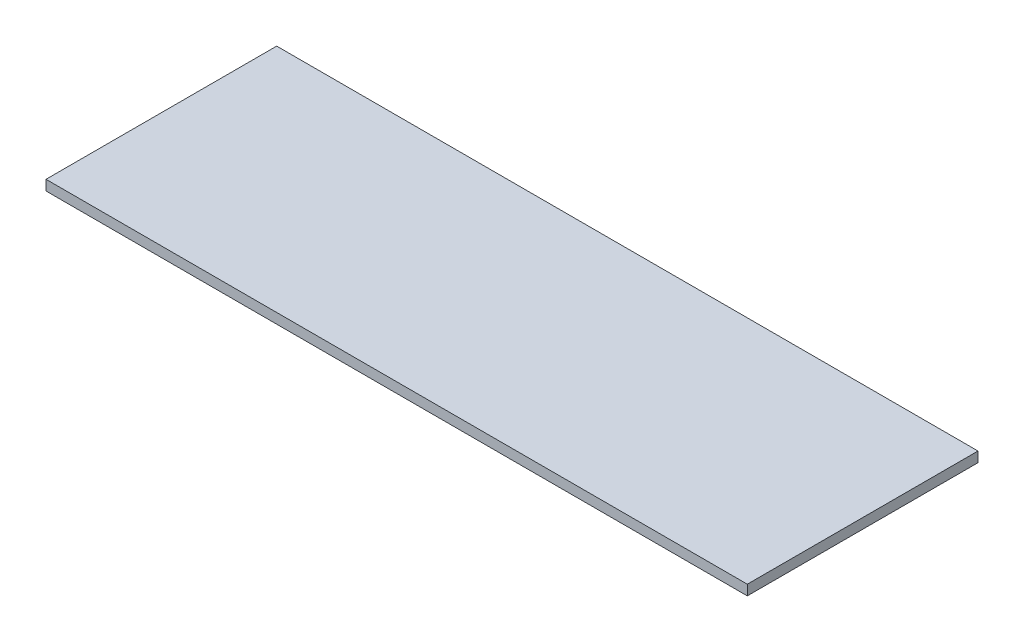
ISO-10303-21;
HEADER;
FILE_DESCRIPTION(('STEP AP214'),'2;1');
FILE_NAME('part.step','',(''),(''),'','','');
FILE_SCHEMA(('AUTOMOTIVE_DESIGN { 1 0 10303 214 1 1 1 1 }'));
ENDSEC;
DATA;
#1=APPLICATION_CONTEXT('core data for automotive mechanical design processes');
#2=APPLICATION_PROTOCOL_DEFINITION('international standard','automotive_design',2000,#1);
#3=PRODUCT_CONTEXT('',#1,'mechanical');
#4=PRODUCT('Part','Part','',(#3));
#5=PRODUCT_RELATED_PRODUCT_CATEGORY('part','',(#4));
#6=PRODUCT_DEFINITION_FORMATION('','',#4);
#7=PRODUCT_DEFINITION_CONTEXT('part definition',#1,'design');
#8=PRODUCT_DEFINITION('design','',#6,#7);
#9=PRODUCT_DEFINITION_SHAPE('','',#8);
#10=(LENGTH_UNIT() NAMED_UNIT(*) SI_UNIT(.MILLI.,.METRE.));
#11=(NAMED_UNIT(*) PLANE_ANGLE_UNIT() SI_UNIT($,.RADIAN.));
#12=(NAMED_UNIT(*) SI_UNIT($,.STERADIAN.) SOLID_ANGLE_UNIT());
#13=UNCERTAINTY_MEASURE_WITH_UNIT(LENGTH_MEASURE(1.E-05),#10,'distance_accuracy_value','');
#14=(GEOMETRIC_REPRESENTATION_CONTEXT(3) GLOBAL_UNCERTAINTY_ASSIGNED_CONTEXT((#13)) GLOBAL_UNIT_ASSIGNED_CONTEXT((#10,
#11,#12)) REPRESENTATION_CONTEXT('',''));
#15=CARTESIAN_POINT('',(0.,0.,0.));
#16=DIRECTION('',(0.,0.,1.));
#17=DIRECTION('',(1.,0.,0.));
#18=AXIS2_PLACEMENT_3D('',#15,#16,#17);
#19=CARTESIAN_POINT('',(38.,1.1,-12.5));
#20=DIRECTION('',(-1.,0.,0.));
#21=DIRECTION('',(0.,0.,1.));
#22=AXIS2_PLACEMENT_3D('',#19,#20,#21);
#23=PLANE('',#22);
#24=DIRECTION('',(0.,0.,-1.));
#25=VECTOR('',#24,1.);
#26=CARTESIAN_POINT('',(38.,0.,-12.5));
#27=LINE('',#26,#25);
#28=CARTESIAN_POINT('',(38.,0.,12.5));
#29=VERTEX_POINT('',#28);
#30=CARTESIAN_POINT('',(38.,0.,-12.5));
#31=VERTEX_POINT('',#30);
#32=EDGE_CURVE('E97',#29,#31,#27,.T.);
#33=ORIENTED_EDGE('',*,*,#32,.T.);
#34=DIRECTION('',(0.,-1.,0.));
#35=VECTOR('',#34,1.);
#36=CARTESIAN_POINT('',(38.,1.1,-12.5));
#37=LINE('',#36,#35);
#38=CARTESIAN_POINT('',(38.,1.1,-12.5));
#39=VERTEX_POINT('',#38);
#40=EDGE_CURVE('E11',#39,#31,#37,.T.);
#41=ORIENTED_EDGE('',*,*,#40,.F.);
#42=DIRECTION('',(0.,0.,-1.));
#43=VECTOR('',#42,1.);
#44=CARTESIAN_POINT('',(38.,1.1,-12.5));
#45=LINE('',#44,#43);
#46=CARTESIAN_POINT('',(38.,1.1,12.5));
#47=VERTEX_POINT('',#46);
#48=EDGE_CURVE('E85',#47,#39,#45,.T.);
#49=ORIENTED_EDGE('',*,*,#48,.F.);
#50=DIRECTION('',(0.,-1.,0.));
#51=VECTOR('',#50,1.);
#52=CARTESIAN_POINT('',(38.,1.1,12.5));
#53=LINE('',#52,#51);
#54=EDGE_CURVE('E93',#47,#29,#53,.T.);
#55=ORIENTED_EDGE('',*,*,#54,.T.);
#56=EDGE_LOOP('',(#33,#41,#49,#55));
#57=FACE_BOUND('',#56,.T.);
#58=ADVANCED_FACE('F34',(#57),#23,.F.);
#59=CARTESIAN_POINT('',(-38.,1.1,-12.5));
#60=DIRECTION('',(0.,0.,1.));
#61=DIRECTION('',(1.,0.,0.));
#62=AXIS2_PLACEMENT_3D('',#59,#60,#61);
#63=PLANE('',#62);
#64=DIRECTION('',(-1.,0.,0.));
#65=VECTOR('',#64,1.);
#66=CARTESIAN_POINT('',(-38.,0.,-12.5));
#67=LINE('',#66,#65);
#68=CARTESIAN_POINT('',(-38.,0.,-12.5));
#69=VERTEX_POINT('',#68);
#70=EDGE_CURVE('E89',#31,#69,#67,.T.);
#71=ORIENTED_EDGE('',*,*,#70,.T.);
#72=DIRECTION('',(0.,-1.,0.));
#73=VECTOR('',#72,1.);
#74=CARTESIAN_POINT('',(-38.,1.1,-12.5));
#75=LINE('',#74,#73);
#76=CARTESIAN_POINT('',(-38.,1.1,-12.5));
#77=VERTEX_POINT('',#76);
#78=EDGE_CURVE('E42',#77,#69,#75,.T.);
#79=ORIENTED_EDGE('',*,*,#78,.F.);
#80=DIRECTION('',(-1.,0.,0.));
#81=VECTOR('',#80,1.);
#82=CARTESIAN_POINT('',(-38.,1.1,-12.5));
#83=LINE('',#82,#81);
#84=EDGE_CURVE('E80',#39,#77,#83,.T.);
#85=ORIENTED_EDGE('',*,*,#84,.F.);
#86=ORIENTED_EDGE('',*,*,#40,.T.);
#87=EDGE_LOOP('',(#71,#79,#85,#86));
#88=FACE_BOUND('',#87,.T.);
#89=ADVANCED_FACE('F88',(#88),#63,.F.);
#90=CARTESIAN_POINT('',(-38.,1.1,-12.5));
#91=DIRECTION('',(1.,0.,0.));
#92=DIRECTION('',(0.,0.,-1.));
#93=AXIS2_PLACEMENT_3D('',#90,#91,#92);
#94=PLANE('',#93);
#95=DIRECTION('',(0.,0.,1.));
#96=VECTOR('',#95,1.);
#97=CARTESIAN_POINT('',(-38.,0.,-12.5));
#98=LINE('',#97,#96);
#99=CARTESIAN_POINT('',(-38.,0.,12.5));
#100=VERTEX_POINT('',#99);
#101=EDGE_CURVE('E67',#69,#100,#98,.T.);
#102=ORIENTED_EDGE('',*,*,#101,.T.);
#103=DIRECTION('',(0.,-1.,0.));
#104=VECTOR('',#103,1.);
#105=CARTESIAN_POINT('',(-38.,1.1,12.5));
#106=LINE('',#105,#104);
#107=CARTESIAN_POINT('',(-38.,1.1,12.5));
#108=VERTEX_POINT('',#107);
#109=EDGE_CURVE('E90',#108,#100,#106,.T.);
#110=ORIENTED_EDGE('',*,*,#109,.F.);
#111=DIRECTION('',(0.,0.,1.));
#112=VECTOR('',#111,1.);
#113=CARTESIAN_POINT('',(-38.,1.1,-12.5));
#114=LINE('',#113,#112);
#115=EDGE_CURVE('E83',#77,#108,#114,.T.);
#116=ORIENTED_EDGE('',*,*,#115,.F.);
#117=ORIENTED_EDGE('',*,*,#78,.T.);
#118=EDGE_LOOP('',(#102,#110,#116,#117));
#119=FACE_BOUND('',#118,.T.);
#120=ADVANCED_FACE('F91',(#119),#94,.F.);
#121=CARTESIAN_POINT('',(-38.,1.1,12.5));
#122=DIRECTION('',(0.,0.,-1.));
#123=DIRECTION('',(-1.,0.,0.));
#124=AXIS2_PLACEMENT_3D('',#121,#122,#123);
#125=PLANE('',#124);
#126=DIRECTION('',(1.,0.,0.));
#127=VECTOR('',#126,1.);
#128=CARTESIAN_POINT('',(-38.,0.,12.5));
#129=LINE('',#128,#127);
#130=EDGE_CURVE('E73',#100,#29,#129,.T.);
#131=ORIENTED_EDGE('',*,*,#130,.T.);
#132=ORIENTED_EDGE('',*,*,#54,.F.);
#133=DIRECTION('',(1.,0.,0.));
#134=VECTOR('',#133,1.);
#135=CARTESIAN_POINT('',(-38.,1.1,12.5));
#136=LINE('',#135,#134);
#137=EDGE_CURVE('E50',#108,#47,#136,.T.);
#138=ORIENTED_EDGE('',*,*,#137,.F.);
#139=ORIENTED_EDGE('',*,*,#109,.T.);
#140=EDGE_LOOP('',(#131,#132,#138,#139));
#141=FACE_BOUND('',#140,.T.);
#142=ADVANCED_FACE('F104',(#141),#125,.F.);
#143=CARTESIAN_POINT('',(0.,1.1,0.));
#144=DIRECTION('',(0.,1.,0.));
#145=DIRECTION('',(0.,0.,1.));
#146=AXIS2_PLACEMENT_3D('',#143,#144,#145);
#147=PLANE('',#146);
#148=ORIENTED_EDGE('',*,*,#48,.T.);
#149=ORIENTED_EDGE('',*,*,#84,.T.);
#150=ORIENTED_EDGE('',*,*,#115,.T.);
#151=ORIENTED_EDGE('',*,*,#137,.T.);
#152=EDGE_LOOP('',(#148,#149,#150,#151));
#153=FACE_BOUND('',#152,.T.);
#154=ADVANCED_FACE('F81',(#153),#147,.T.);
#155=CARTESIAN_POINT('',(0.,0.,0.));
#156=DIRECTION('',(0.,1.,0.));
#157=DIRECTION('',(0.,0.,1.));
#158=AXIS2_PLACEMENT_3D('',#155,#156,#157);
#159=PLANE('',#158);
#160=ORIENTED_EDGE('',*,*,#32,.F.);
#161=ORIENTED_EDGE('',*,*,#130,.F.);
#162=ORIENTED_EDGE('',*,*,#101,.F.);
#163=ORIENTED_EDGE('',*,*,#70,.F.);
#164=EDGE_LOOP('',(#160,#161,#162,#163));
#165=FACE_BOUND('',#164,.T.);
#166=ADVANCED_FACE('F107',(#165),#159,.F.);
#167=CLOSED_SHELL('',(#58,#89,#120,#142,#154,#166));
#168=MANIFOLD_SOLID_BREP('B2',#167);
#169=ADVANCED_BREP_SHAPE_REPRESENTATION('',(#18,#168),#14);
#170=SHAPE_DEFINITION_REPRESENTATION(#9,#169);
ENDSEC;
END-ISO-10303-21;
